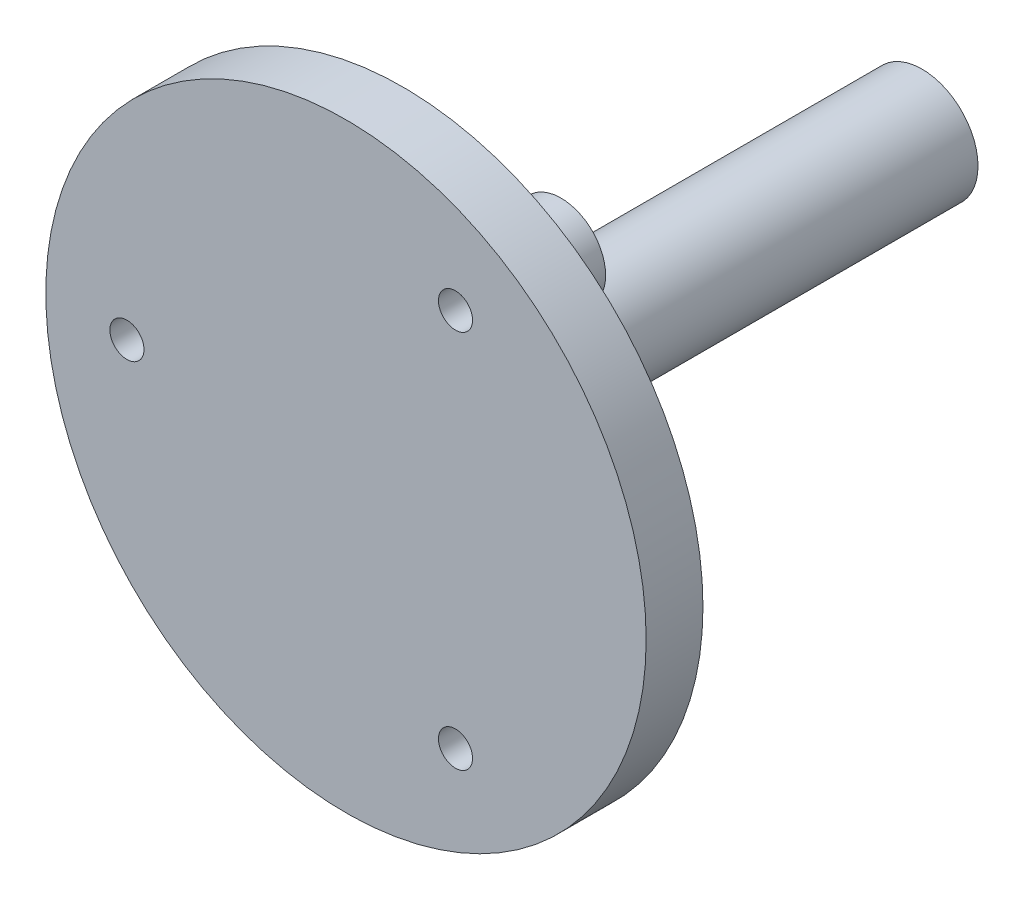
ISO-10303-21;
HEADER;
FILE_DESCRIPTION(('STEP AP214'),'2;1');
FILE_NAME('part.step','',(''),(''),'','','');
FILE_SCHEMA(('AUTOMOTIVE_DESIGN { 1 0 10303 214 1 1 1 1 }'));
ENDSEC;
DATA;
#1=APPLICATION_CONTEXT('core data for automotive mechanical design processes');
#2=APPLICATION_PROTOCOL_DEFINITION('international standard','automotive_design',2000,#1);
#3=PRODUCT_CONTEXT('',#1,'mechanical');
#4=PRODUCT('Part','Part','',(#3));
#5=PRODUCT_RELATED_PRODUCT_CATEGORY('part','',(#4));
#6=PRODUCT_DEFINITION_FORMATION('','',#4);
#7=PRODUCT_DEFINITION_CONTEXT('part definition',#1,'design');
#8=PRODUCT_DEFINITION('design','',#6,#7);
#9=PRODUCT_DEFINITION_SHAPE('','',#8);
#10=(LENGTH_UNIT() NAMED_UNIT(*) SI_UNIT(.MILLI.,.METRE.));
#11=(NAMED_UNIT(*) PLANE_ANGLE_UNIT() SI_UNIT($,.RADIAN.));
#12=(NAMED_UNIT(*) SI_UNIT($,.STERADIAN.) SOLID_ANGLE_UNIT());
#13=UNCERTAINTY_MEASURE_WITH_UNIT(LENGTH_MEASURE(1.E-05),#10,'distance_accuracy_value','');
#14=(GEOMETRIC_REPRESENTATION_CONTEXT(3) GLOBAL_UNCERTAINTY_ASSIGNED_CONTEXT((#13)) GLOBAL_UNIT_ASSIGNED_CONTEXT((#10,
#11,#12)) REPRESENTATION_CONTEXT('',''));
#15=CARTESIAN_POINT('',(0.,0.,0.));
#16=DIRECTION('',(0.,0.,1.));
#17=DIRECTION('',(1.,0.,0.));
#18=AXIS2_PLACEMENT_3D('',#15,#16,#17);
#19=CARTESIAN_POINT('',(0.,0.,0.));
#20=DIRECTION('',(0.,0.,-1.));
#21=DIRECTION('',(-1.,0.,0.));
#22=AXIS2_PLACEMENT_3D('',#19,#20,#21);
#23=CYLINDRICAL_SURFACE('',#22,18.5);
#24=CARTESIAN_POINT('',(0.,0.,0.));
#25=DIRECTION('',(0.,0.,1.));
#26=DIRECTION('',(1.,0.,0.));
#27=AXIS2_PLACEMENT_3D('',#24,#25,#26);
#28=CIRCLE('',#27,18.5);
#29=CARTESIAN_POINT('',(18.5,0.,0.));
#30=VERTEX_POINT('',#29);
#31=EDGE_CURVE('E76',#30,#30,#28,.T.);
#32=ORIENTED_EDGE('',*,*,#31,.F.);
#33=EDGE_LOOP('',(#32));
#34=FACE_BOUND('',#33,.T.);
#35=CARTESIAN_POINT('',(0.,0.,-3.5));
#36=DIRECTION('',(0.,0.,1.));
#37=DIRECTION('',(1.,0.,0.));
#38=AXIS2_PLACEMENT_3D('',#35,#36,#37);
#39=CIRCLE('',#38,18.5);
#40=CARTESIAN_POINT('',(18.5,0.,-3.5));
#41=VERTEX_POINT('',#40);
#42=EDGE_CURVE('E77',#41,#41,#39,.T.);
#43=ORIENTED_EDGE('',*,*,#42,.T.);
#44=EDGE_LOOP('',(#43));
#45=FACE_BOUND('',#44,.T.);
#46=ADVANCED_FACE('F39',(#34,#45),#23,.T.);
#47=CARTESIAN_POINT('',(0.,0.,0.));
#48=DIRECTION('',(0.,0.,1.));
#49=DIRECTION('',(1.,0.,0.));
#50=AXIS2_PLACEMENT_3D('',#47,#48,#49);
#51=PLANE('',#50);
#52=CARTESIAN_POINT('',(-13.5,0.,0.));
#53=DIRECTION('',(0.,0.,1.));
#54=DIRECTION('',(1.,0.,0.));
#55=AXIS2_PLACEMENT_3D('',#52,#53,#54);
#56=CIRCLE('',#55,1.05);
#57=CARTESIAN_POINT('',(-12.45,0.,0.));
#58=VERTEX_POINT('',#57);
#59=EDGE_CURVE('E100',#58,#58,#56,.F.);
#60=ORIENTED_EDGE('',*,*,#59,.T.);
#61=EDGE_LOOP('',(#60));
#62=FACE_BOUND('',#61,.T.);
#63=CARTESIAN_POINT('',(6.75,-11.6913429510899,0.));
#64=DIRECTION('',(0.,0.,1.));
#65=DIRECTION('',(1.,0.,0.));
#66=AXIS2_PLACEMENT_3D('',#63,#64,#65);
#67=CIRCLE('',#66,1.05);
#68=CARTESIAN_POINT('',(7.8,-11.6913429510899,0.));
#69=VERTEX_POINT('',#68);
#70=EDGE_CURVE('E55',#69,#69,#67,.F.);
#71=ORIENTED_EDGE('',*,*,#70,.T.);
#72=EDGE_LOOP('',(#71));
#73=FACE_BOUND('',#72,.T.);
#74=CARTESIAN_POINT('',(6.75,11.6913429510899,0.));
#75=DIRECTION('',(0.,0.,1.));
#76=DIRECTION('',(1.,0.,0.));
#77=AXIS2_PLACEMENT_3D('',#74,#75,#76);
#78=CIRCLE('',#77,1.05);
#79=CARTESIAN_POINT('',(7.8,11.6913429510899,0.));
#80=VERTEX_POINT('',#79);
#81=EDGE_CURVE('E61',#80,#80,#78,.F.);
#82=ORIENTED_EDGE('',*,*,#81,.T.);
#83=EDGE_LOOP('',(#82));
#84=FACE_BOUND('',#83,.T.);
#85=ORIENTED_EDGE('',*,*,#31,.T.);
#86=EDGE_LOOP('',(#85));
#87=FACE_BOUND('',#86,.T.);
#88=ADVANCED_FACE('F126',(#62,#73,#84,#87),#51,.T.);
#89=CARTESIAN_POINT('',(0.,0.,-3.5));
#90=DIRECTION('',(0.,0.,1.));
#91=DIRECTION('',(1.,0.,0.));
#92=AXIS2_PLACEMENT_3D('',#89,#90,#91);
#93=PLANE('',#92);
#94=CARTESIAN_POINT('',(-13.5,0.,-3.5));
#95=DIRECTION('',(0.,0.,1.));
#96=DIRECTION('',(1.,0.,0.));
#97=AXIS2_PLACEMENT_3D('',#94,#95,#96);
#98=CIRCLE('',#97,2.75);
#99=CARTESIAN_POINT('',(-10.75,0.,-3.5));
#100=VERTEX_POINT('',#99);
#101=EDGE_CURVE('E10',#100,#100,#98,.F.);
#102=ORIENTED_EDGE('',*,*,#101,.F.);
#103=EDGE_LOOP('',(#102));
#104=FACE_BOUND('',#103,.T.);
#105=CARTESIAN_POINT('',(6.75,-11.6913429510899,-3.5));
#106=DIRECTION('',(0.,0.,1.));
#107=DIRECTION('',(1.,0.,0.));
#108=AXIS2_PLACEMENT_3D('',#105,#106,#107);
#109=CIRCLE('',#108,2.75);
#110=CARTESIAN_POINT('',(9.5,-11.6913429510899,-3.5));
#111=VERTEX_POINT('',#110);
#112=EDGE_CURVE('E46',#111,#111,#109,.F.);
#113=ORIENTED_EDGE('',*,*,#112,.F.);
#114=EDGE_LOOP('',(#113));
#115=FACE_BOUND('',#114,.T.);
#116=CARTESIAN_POINT('',(6.75,11.6913429510899,-3.5));
#117=DIRECTION('',(0.,0.,1.));
#118=DIRECTION('',(1.,0.,0.));
#119=AXIS2_PLACEMENT_3D('',#116,#117,#118);
#120=CIRCLE('',#119,2.75);
#121=CARTESIAN_POINT('',(9.5,11.6913429510899,-3.5));
#122=VERTEX_POINT('',#121);
#123=EDGE_CURVE('E50',#122,#122,#120,.F.);
#124=ORIENTED_EDGE('',*,*,#123,.F.);
#125=EDGE_LOOP('',(#124));
#126=FACE_BOUND('',#125,.T.);
#127=CARTESIAN_POINT('',(0.,0.,-3.5));
#128=DIRECTION('',(0.,0.,1.));
#129=DIRECTION('',(1.,0.,0.));
#130=AXIS2_PLACEMENT_3D('',#127,#128,#129);
#131=CIRCLE('',#130,4.5);
#132=CARTESIAN_POINT('',(4.5,0.,-3.5));
#133=VERTEX_POINT('',#132);
#134=EDGE_CURVE('E65',#133,#133,#131,.F.);
#135=ORIENTED_EDGE('',*,*,#134,.F.);
#136=EDGE_LOOP('',(#135));
#137=FACE_BOUND('',#136,.T.);
#138=ORIENTED_EDGE('',*,*,#42,.F.);
#139=EDGE_LOOP('',(#138));
#140=FACE_BOUND('',#139,.T.);
#141=ADVANCED_FACE('F131',(#104,#115,#126,#137,#140),#93,.F.);
#142=CARTESIAN_POINT('',(0.,0.,-3.5));
#143=DIRECTION('',(0.,0.,-1.));
#144=DIRECTION('',(-1.,0.,0.));
#145=AXIS2_PLACEMENT_3D('',#142,#143,#144);
#146=CYLINDRICAL_SURFACE('',#145,4.5);
#147=ORIENTED_EDGE('',*,*,#134,.T.);
#148=EDGE_LOOP('',(#147));
#149=FACE_BOUND('',#148,.T.);
#150=CARTESIAN_POINT('',(0.,0.,-3.7));
#151=DIRECTION('',(0.,0.,1.));
#152=DIRECTION('',(1.,0.,0.));
#153=AXIS2_PLACEMENT_3D('',#150,#151,#152);
#154=CIRCLE('',#153,4.5);
#155=CARTESIAN_POINT('',(4.5,0.,-3.7));
#156=VERTEX_POINT('',#155);
#157=EDGE_CURVE('E69',#156,#156,#154,.T.);
#158=ORIENTED_EDGE('',*,*,#157,.T.);
#159=EDGE_LOOP('',(#158));
#160=FACE_BOUND('',#159,.T.);
#161=ADVANCED_FACE('F138',(#149,#160),#146,.T.);
#162=CARTESIAN_POINT('',(0.,0.,-3.7));
#163=DIRECTION('',(0.,0.,1.));
#164=DIRECTION('',(1.,0.,0.));
#165=AXIS2_PLACEMENT_3D('',#162,#163,#164);
#166=PLANE('',#165);
#167=CARTESIAN_POINT('',(0.,0.,-3.7));
#168=DIRECTION('',(0.,0.,1.));
#169=DIRECTION('',(1.,0.,0.));
#170=AXIS2_PLACEMENT_3D('',#167,#168,#169);
#171=CIRCLE('',#170,3.45);
#172=CARTESIAN_POINT('',(3.45,0.,-3.7));
#173=VERTEX_POINT('',#172);
#174=EDGE_CURVE('E73',#173,#173,#171,.T.);
#175=ORIENTED_EDGE('',*,*,#174,.T.);
#176=EDGE_LOOP('',(#175));
#177=FACE_BOUND('',#176,.T.);
#178=ORIENTED_EDGE('',*,*,#157,.F.);
#179=EDGE_LOOP('',(#178));
#180=FACE_BOUND('',#179,.T.);
#181=ADVANCED_FACE('F143',(#177,#180),#166,.F.);
#182=CARTESIAN_POINT('',(0.,0.,-35.5));
#183=DIRECTION('',(0.,0.,1.));
#184=DIRECTION('',(1.,0.,0.));
#185=AXIS2_PLACEMENT_3D('',#182,#183,#184);
#186=PLANE('',#185);
#187=CARTESIAN_POINT('',(0.,0.,-35.5));
#188=DIRECTION('',(0.,0.,1.));
#189=DIRECTION('',(1.,0.,0.));
#190=AXIS2_PLACEMENT_3D('',#187,#188,#189);
#191=CIRCLE('',#190,1.4);
#192=CARTESIAN_POINT('',(1.4,0.,-35.5));
#193=VERTEX_POINT('',#192);
#194=EDGE_CURVE('E66',#193,#193,#191,.F.);
#195=ORIENTED_EDGE('',*,*,#194,.F.);
#196=EDGE_LOOP('',(#195));
#197=FACE_BOUND('',#196,.T.);
#198=CARTESIAN_POINT('',(0.,0.,-35.5));
#199=DIRECTION('',(0.,0.,1.));
#200=DIRECTION('',(1.,0.,0.));
#201=AXIS2_PLACEMENT_3D('',#198,#199,#200);
#202=CIRCLE('',#201,3.45);
#203=CARTESIAN_POINT('',(3.45,0.,-35.5));
#204=VERTEX_POINT('',#203);
#205=EDGE_CURVE('E80',#204,#204,#202,.T.);
#206=ORIENTED_EDGE('',*,*,#205,.F.);
#207=EDGE_LOOP('',(#206));
#208=FACE_BOUND('',#207,.T.);
#209=ADVANCED_FACE('F152',(#197,#208),#186,.F.);
#210=CARTESIAN_POINT('',(0.,0.,-3.5));
#211=DIRECTION('',(0.,0.,-1.));
#212=DIRECTION('',(-1.,0.,0.));
#213=AXIS2_PLACEMENT_3D('',#210,#211,#212);
#214=CYLINDRICAL_SURFACE('',#213,3.45);
#215=ORIENTED_EDGE('',*,*,#205,.T.);
#216=EDGE_LOOP('',(#215));
#217=FACE_BOUND('',#216,.T.);
#218=ORIENTED_EDGE('',*,*,#174,.F.);
#219=EDGE_LOOP('',(#218));
#220=FACE_BOUND('',#219,.T.);
#221=ADVANCED_FACE('F148',(#217,#220),#214,.T.);
#222=CARTESIAN_POINT('',(0.,0.,-26.51));
#223=DIRECTION('',(0.,0.,-1.));
#224=DIRECTION('',(-1.,0.,0.));
#225=AXIS2_PLACEMENT_3D('',#222,#223,#224);
#226=CYLINDRICAL_SURFACE('',#225,1.4);
#227=CARTESIAN_POINT('',(0.,0.,-26.51));
#228=DIRECTION('',(0.,0.,1.));
#229=DIRECTION('',(1.,0.,0.));
#230=AXIS2_PLACEMENT_3D('',#227,#228,#229);
#231=CIRCLE('',#230,1.4);
#232=CARTESIAN_POINT('',(1.4,0.,-26.51));
#233=VERTEX_POINT('',#232);
#234=EDGE_CURVE('E70',#233,#233,#231,.T.);
#235=ORIENTED_EDGE('',*,*,#234,.T.);
#236=EDGE_LOOP('',(#235));
#237=FACE_BOUND('',#236,.T.);
#238=ORIENTED_EDGE('',*,*,#194,.T.);
#239=EDGE_LOOP('',(#238));
#240=FACE_BOUND('',#239,.T.);
#241=ADVANCED_FACE('F151',(#237,#240),#226,.F.);
#242=CARTESIAN_POINT('',(0.,0.,-26.51));
#243=DIRECTION('',(0.,0.,1.));
#244=DIRECTION('',(1.,0.,0.));
#245=AXIS2_PLACEMENT_3D('',#242,#243,#244);
#246=PLANE('',#245);
#247=ORIENTED_EDGE('',*,*,#234,.F.);
#248=EDGE_LOOP('',(#247));
#249=FACE_BOUND('',#248,.T.);
#250=ADVANCED_FACE('F162',(#249),#246,.F.);
#251=CARTESIAN_POINT('',(6.75,11.6913429510899,-3.5));
#252=DIRECTION('',(0.,0.,-1.));
#253=DIRECTION('',(-1.,0.,0.));
#254=AXIS2_PLACEMENT_3D('',#251,#252,#253);
#255=CYLINDRICAL_SURFACE('',#254,2.75);
#256=ORIENTED_EDGE('',*,*,#123,.T.);
#257=EDGE_LOOP('',(#256));
#258=FACE_BOUND('',#257,.T.);
#259=CARTESIAN_POINT('',(6.75,11.6913429510899,-6.5));
#260=DIRECTION('',(0.,0.,1.));
#261=DIRECTION('',(1.,0.,0.));
#262=AXIS2_PLACEMENT_3D('',#259,#260,#261);
#263=CIRCLE('',#262,2.75);
#264=CARTESIAN_POINT('',(9.5,11.6913429510899,-6.5));
#265=VERTEX_POINT('',#264);
#266=EDGE_CURVE('E89',#265,#265,#263,.T.);
#267=ORIENTED_EDGE('',*,*,#266,.T.);
#268=EDGE_LOOP('',(#267));
#269=FACE_BOUND('',#268,.T.);
#270=ADVANCED_FACE('F166',(#258,#269),#255,.T.);
#271=CARTESIAN_POINT('',(6.75,11.6913429510899,-6.5));
#272=DIRECTION('',(0.,0.,1.));
#273=DIRECTION('',(1.,0.,0.));
#274=AXIS2_PLACEMENT_3D('',#271,#272,#273);
#275=PLANE('',#274);
#276=CARTESIAN_POINT('',(6.75,11.6913429510899,-6.5));
#277=DIRECTION('',(0.,0.,1.));
#278=DIRECTION('',(1.,0.,0.));
#279=AXIS2_PLACEMENT_3D('',#276,#277,#278);
#280=CIRCLE('',#279,1.05);
#281=CARTESIAN_POINT('',(7.8,11.6913429510899,-6.5));
#282=VERTEX_POINT('',#281);
#283=EDGE_CURVE('E58',#282,#282,#280,.F.);
#284=ORIENTED_EDGE('',*,*,#283,.F.);
#285=EDGE_LOOP('',(#284));
#286=FACE_BOUND('',#285,.T.);
#287=ORIENTED_EDGE('',*,*,#266,.F.);
#288=EDGE_LOOP('',(#287));
#289=FACE_BOUND('',#288,.T.);
#290=ADVANCED_FACE('F170',(#286,#289),#275,.F.);
#291=CARTESIAN_POINT('',(6.75,11.6913429510899,0.1));
#292=DIRECTION('',(0.,0.,-1.));
#293=DIRECTION('',(-1.,0.,0.));
#294=AXIS2_PLACEMENT_3D('',#291,#292,#293);
#295=CYLINDRICAL_SURFACE('',#294,1.05);
#296=ORIENTED_EDGE('',*,*,#81,.F.);
#297=EDGE_LOOP('',(#296));
#298=FACE_BOUND('',#297,.T.);
#299=ORIENTED_EDGE('',*,*,#283,.T.);
#300=EDGE_LOOP('',(#299));
#301=FACE_BOUND('',#300,.T.);
#302=ADVANCED_FACE('F174',(#298,#301),#295,.F.);
#303=CARTESIAN_POINT('',(6.75,-11.6913429510899,-3.5));
#304=DIRECTION('',(0.,0.,-1.));
#305=DIRECTION('',(-1.,0.,0.));
#306=AXIS2_PLACEMENT_3D('',#303,#304,#305);
#307=CYLINDRICAL_SURFACE('',#306,2.75);
#308=ORIENTED_EDGE('',*,*,#112,.T.);
#309=EDGE_LOOP('',(#308));
#310=FACE_BOUND('',#309,.T.);
#311=CARTESIAN_POINT('',(6.75,-11.6913429510899,-6.5));
#312=DIRECTION('',(0.,0.,1.));
#313=DIRECTION('',(1.,0.,0.));
#314=AXIS2_PLACEMENT_3D('',#311,#312,#313);
#315=CIRCLE('',#314,2.75);
#316=CARTESIAN_POINT('',(9.5,-11.6913429510899,-6.5));
#317=VERTEX_POINT('',#316);
#318=EDGE_CURVE('E62',#317,#317,#315,.T.);
#319=ORIENTED_EDGE('',*,*,#318,.T.);
#320=EDGE_LOOP('',(#319));
#321=FACE_BOUND('',#320,.T.);
#322=ADVANCED_FACE('F178',(#310,#321),#307,.T.);
#323=CARTESIAN_POINT('',(6.75,-11.6913429510899,-6.5));
#324=DIRECTION('',(0.,0.,1.));
#325=DIRECTION('',(1.,0.,0.));
#326=AXIS2_PLACEMENT_3D('',#323,#324,#325);
#327=PLANE('',#326);
#328=CARTESIAN_POINT('',(6.75,-11.6913429510899,-6.5));
#329=DIRECTION('',(0.,0.,1.));
#330=DIRECTION('',(1.,0.,0.));
#331=AXIS2_PLACEMENT_3D('',#328,#329,#330);
#332=CIRCLE('',#331,1.05);
#333=CARTESIAN_POINT('',(7.8,-11.6913429510899,-6.5));
#334=VERTEX_POINT('',#333);
#335=EDGE_CURVE('E53',#334,#334,#332,.F.);
#336=ORIENTED_EDGE('',*,*,#335,.F.);
#337=EDGE_LOOP('',(#336));
#338=FACE_BOUND('',#337,.T.);
#339=ORIENTED_EDGE('',*,*,#318,.F.);
#340=EDGE_LOOP('',(#339));
#341=FACE_BOUND('',#340,.T.);
#342=ADVANCED_FACE('F122',(#338,#341),#327,.F.);
#343=CARTESIAN_POINT('',(6.75,-11.6913429510899,0.1));
#344=DIRECTION('',(0.,0.,-1.));
#345=DIRECTION('',(-1.,0.,0.));
#346=AXIS2_PLACEMENT_3D('',#343,#344,#345);
#347=CYLINDRICAL_SURFACE('',#346,1.05);
#348=ORIENTED_EDGE('',*,*,#70,.F.);
#349=EDGE_LOOP('',(#348));
#350=FACE_BOUND('',#349,.T.);
#351=ORIENTED_EDGE('',*,*,#335,.T.);
#352=EDGE_LOOP('',(#351));
#353=FACE_BOUND('',#352,.T.);
#354=ADVANCED_FACE('F117',(#350,#353),#347,.F.);
#355=CARTESIAN_POINT('',(-13.5,0.,-3.5));
#356=DIRECTION('',(0.,0.,-1.));
#357=DIRECTION('',(-1.,0.,0.));
#358=AXIS2_PLACEMENT_3D('',#355,#356,#357);
#359=CYLINDRICAL_SURFACE('',#358,2.75);
#360=ORIENTED_EDGE('',*,*,#101,.T.);
#361=EDGE_LOOP('',(#360));
#362=FACE_BOUND('',#361,.T.);
#363=CARTESIAN_POINT('',(-13.5,0.,-6.5));
#364=DIRECTION('',(0.,0.,1.));
#365=DIRECTION('',(1.,0.,0.));
#366=AXIS2_PLACEMENT_3D('',#363,#364,#365);
#367=CIRCLE('',#366,2.75);
#368=CARTESIAN_POINT('',(-10.75,0.,-6.5));
#369=VERTEX_POINT('',#368);
#370=EDGE_CURVE('E56',#369,#369,#367,.T.);
#371=ORIENTED_EDGE('',*,*,#370,.T.);
#372=EDGE_LOOP('',(#371));
#373=FACE_BOUND('',#372,.T.);
#374=ADVANCED_FACE('F112',(#362,#373),#359,.T.);
#375=CARTESIAN_POINT('',(-13.5,0.,-6.5));
#376=DIRECTION('',(0.,0.,1.));
#377=DIRECTION('',(1.,0.,0.));
#378=AXIS2_PLACEMENT_3D('',#375,#376,#377);
#379=PLANE('',#378);
#380=CARTESIAN_POINT('',(-13.5,0.,-6.5));
#381=DIRECTION('',(0.,0.,1.));
#382=DIRECTION('',(1.,0.,0.));
#383=AXIS2_PLACEMENT_3D('',#380,#381,#382);
#384=CIRCLE('',#383,1.05);
#385=CARTESIAN_POINT('',(-12.45,0.,-6.5));
#386=VERTEX_POINT('',#385);
#387=EDGE_CURVE('E42',#386,#386,#384,.F.);
#388=ORIENTED_EDGE('',*,*,#387,.F.);
#389=EDGE_LOOP('',(#388));
#390=FACE_BOUND('',#389,.T.);
#391=ORIENTED_EDGE('',*,*,#370,.F.);
#392=EDGE_LOOP('',(#391));
#393=FACE_BOUND('',#392,.T.);
#394=ADVANCED_FACE('F109',(#390,#393),#379,.F.);
#395=CARTESIAN_POINT('',(-13.5,0.,0.1));
#396=DIRECTION('',(0.,0.,-1.));
#397=DIRECTION('',(-1.,0.,0.));
#398=AXIS2_PLACEMENT_3D('',#395,#396,#397);
#399=CYLINDRICAL_SURFACE('',#398,1.05);
#400=ORIENTED_EDGE('',*,*,#59,.F.);
#401=EDGE_LOOP('',(#400));
#402=FACE_BOUND('',#401,.T.);
#403=ORIENTED_EDGE('',*,*,#387,.T.);
#404=EDGE_LOOP('',(#403));
#405=FACE_BOUND('',#404,.T.);
#406=ADVANCED_FACE('F107',(#402,#405),#399,.F.);
#407=CLOSED_SHELL('',(#46,#88,#141,#161,#181,#209,#221,#241,#250,#270,#290,#302,#322,#342,#354,
#374,#394,#406));
#408=MANIFOLD_SOLID_BREP('B2',#407);
#409=ADVANCED_BREP_SHAPE_REPRESENTATION('',(#18,#408),#14);
#410=SHAPE_DEFINITION_REPRESENTATION(#9,#409);
ENDSEC;
END-ISO-10303-21;
